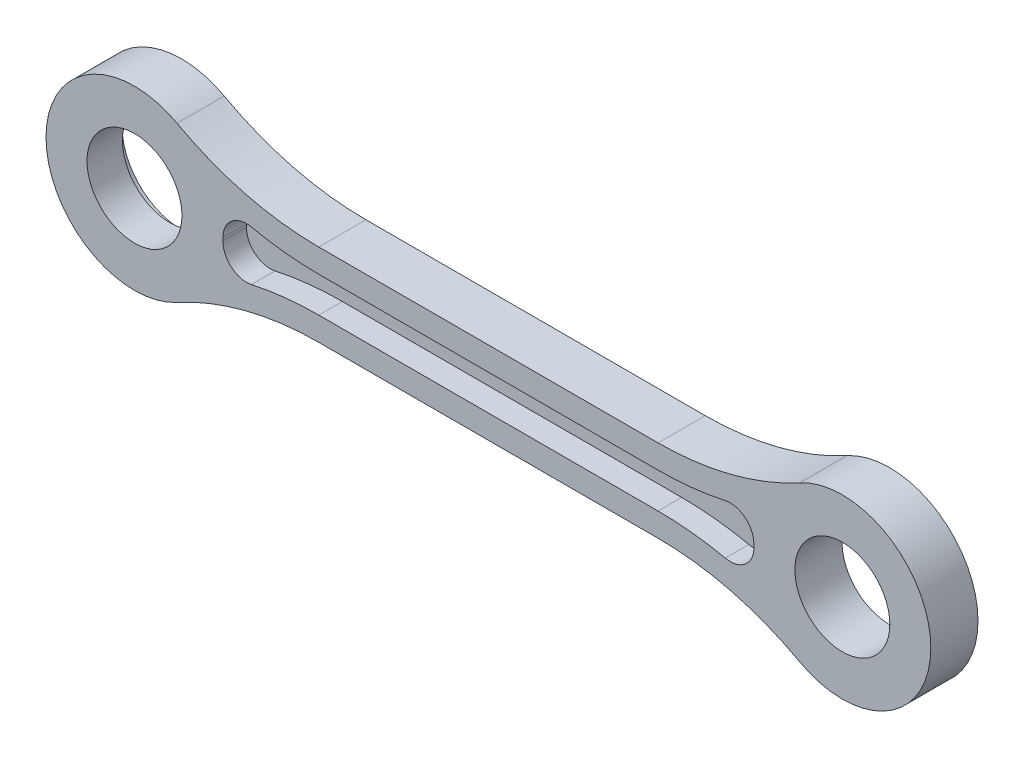
ISO-10303-21;
HEADER;
FILE_DESCRIPTION(('STEP AP214'),'2;1');
FILE_NAME('part.step','',(''),(''),'','','');
FILE_SCHEMA(('AUTOMOTIVE_DESIGN { 1 0 10303 214 1 1 1 1 }'));
ENDSEC;
DATA;
#1=APPLICATION_CONTEXT('core data for automotive mechanical design processes');
#2=APPLICATION_PROTOCOL_DEFINITION('international standard','automotive_design',2000,#1);
#3=PRODUCT_CONTEXT('',#1,'mechanical');
#4=PRODUCT('Part','Part','',(#3));
#5=PRODUCT_RELATED_PRODUCT_CATEGORY('part','',(#4));
#6=PRODUCT_DEFINITION_FORMATION('','',#4);
#7=PRODUCT_DEFINITION_CONTEXT('part definition',#1,'design');
#8=PRODUCT_DEFINITION('design','',#6,#7);
#9=PRODUCT_DEFINITION_SHAPE('','',#8);
#10=(LENGTH_UNIT() NAMED_UNIT(*) SI_UNIT(.MILLI.,.METRE.));
#11=(NAMED_UNIT(*) PLANE_ANGLE_UNIT() SI_UNIT($,.RADIAN.));
#12=(NAMED_UNIT(*) SI_UNIT($,.STERADIAN.) SOLID_ANGLE_UNIT());
#13=UNCERTAINTY_MEASURE_WITH_UNIT(LENGTH_MEASURE(1.E-05),#10,'distance_accuracy_value','');
#14=(GEOMETRIC_REPRESENTATION_CONTEXT(3) GLOBAL_UNCERTAINTY_ASSIGNED_CONTEXT((#13)) GLOBAL_UNIT_ASSIGNED_CONTEXT((#10,
#11,#12)) REPRESENTATION_CONTEXT('',''));
#15=CARTESIAN_POINT('',(0.,0.,0.));
#16=DIRECTION('',(0.,0.,1.));
#17=DIRECTION('',(1.,0.,0.));
#18=AXIS2_PLACEMENT_3D('',#15,#16,#17);
#19=CARTESIAN_POINT('',(-30.,0.,4.));
#20=DIRECTION('',(0.,0.,1.));
#21=DIRECTION('',(1.,0.,0.));
#22=AXIS2_PLACEMENT_3D('',#19,#20,#21);
#23=PLANE('',#22);
#24=CARTESIAN_POINT('',(-30.,0.,4.));
#25=DIRECTION('',(0.,0.,1.));
#26=DIRECTION('',(1.,0.,0.));
#27=AXIS2_PLACEMENT_3D('',#24,#25,#26);
#28=CIRCLE('',#27,4.025);
#29=CARTESIAN_POINT('',(-25.975,0.,4.));
#30=VERTEX_POINT('',#29);
#31=EDGE_CURVE('E291',#30,#30,#28,.T.);
#32=ORIENTED_EDGE('',*,*,#31,.F.);
#33=EDGE_LOOP('',(#32));
#34=FACE_BOUND('',#33,.T.);
#35=CARTESIAN_POINT('',(30.,0.,4.));
#36=DIRECTION('',(0.,0.,1.));
#37=DIRECTION('',(1.,0.,0.));
#38=AXIS2_PLACEMENT_3D('',#35,#36,#37);
#39=CIRCLE('',#38,4.025);
#40=CARTESIAN_POINT('',(34.025,0.,4.));
#41=VERTEX_POINT('',#40);
#42=EDGE_CURVE('E288',#41,#41,#39,.T.);
#43=ORIENTED_EDGE('',*,*,#42,.F.);
#44=EDGE_LOOP('',(#43));
#45=FACE_BOUND('',#44,.T.);
#46=CARTESIAN_POINT('',(-14.3795006481867,28.5,4.));
#47=DIRECTION('',(0.,0.,1.));
#48=DIRECTION('',(1.,0.,0.));
#49=AXIS2_PLACEMENT_3D('',#46,#47,#48);
#50=CIRCLE('',#49,25.);
#51=CARTESIAN_POINT('',(-14.3795006481867,3.5,4.));
#52=VERTEX_POINT('',#51);
#53=CARTESIAN_POINT('',(-26.3952693803508,6.57692307692308,4.));
#54=VERTEX_POINT('',#53);
#55=EDGE_CURVE('E249',#52,#54,#50,.F.);
#56=ORIENTED_EDGE('',*,*,#55,.T.);
#57=CARTESIAN_POINT('',(-30.,0.,4.));
#58=DIRECTION('',(0.,0.,1.));
#59=DIRECTION('',(1.,0.,0.));
#60=AXIS2_PLACEMENT_3D('',#57,#58,#59);
#61=CIRCLE('',#60,7.5);
#62=CARTESIAN_POINT('',(-26.3952693803508,-6.57692307692308,4.));
#63=VERTEX_POINT('',#62);
#64=EDGE_CURVE('E297',#54,#63,#61,.T.);
#65=ORIENTED_EDGE('',*,*,#64,.T.);
#66=CARTESIAN_POINT('',(-14.3795006481867,-28.5,4.));
#67=DIRECTION('',(0.,0.,1.));
#68=DIRECTION('',(1.,0.,0.));
#69=AXIS2_PLACEMENT_3D('',#66,#67,#68);
#70=CIRCLE('',#69,25.);
#71=CARTESIAN_POINT('',(-14.3795006481867,-3.5,4.));
#72=VERTEX_POINT('',#71);
#73=EDGE_CURVE('E276',#72,#63,#70,.T.);
#74=ORIENTED_EDGE('',*,*,#73,.F.);
#75=DIRECTION('',(1.,0.,0.));
#76=VECTOR('',#75,1.);
#77=CARTESIAN_POINT('',(0.,-3.5,4.));
#78=LINE('',#77,#76);
#79=CARTESIAN_POINT('',(14.3795006481867,-3.5,4.));
#80=VERTEX_POINT('',#79);
#81=EDGE_CURVE('E273',#72,#80,#78,.T.);
#82=ORIENTED_EDGE('',*,*,#81,.T.);
#83=CARTESIAN_POINT('',(14.3795006481867,-28.5,4.));
#84=DIRECTION('',(0.,0.,1.));
#85=DIRECTION('',(1.,0.,0.));
#86=AXIS2_PLACEMENT_3D('',#83,#84,#85);
#87=CIRCLE('',#86,25.);
#88=CARTESIAN_POINT('',(26.3952693803508,-6.57692307692309,4.));
#89=VERTEX_POINT('',#88);
#90=EDGE_CURVE('E270',#80,#89,#87,.F.);
#91=ORIENTED_EDGE('',*,*,#90,.T.);
#92=CARTESIAN_POINT('',(30.,0.,4.));
#93=DIRECTION('',(0.,0.,1.));
#94=DIRECTION('',(1.,0.,0.));
#95=AXIS2_PLACEMENT_3D('',#92,#93,#94);
#96=CIRCLE('',#95,7.5);
#97=CARTESIAN_POINT('',(26.3952693803508,6.57692307692309,4.));
#98=VERTEX_POINT('',#97);
#99=EDGE_CURVE('E299',#89,#98,#96,.T.);
#100=ORIENTED_EDGE('',*,*,#99,.T.);
#101=CARTESIAN_POINT('',(14.3795006481867,28.5,4.));
#102=DIRECTION('',(0.,0.,1.));
#103=DIRECTION('',(1.,0.,0.));
#104=AXIS2_PLACEMENT_3D('',#101,#102,#103);
#105=CIRCLE('',#104,25.);
#106=CARTESIAN_POINT('',(14.3795006481867,3.5,4.));
#107=VERTEX_POINT('',#106);
#108=EDGE_CURVE('E256',#107,#98,#105,.T.);
#109=ORIENTED_EDGE('',*,*,#108,.F.);
#110=DIRECTION('',(1.,0.,0.));
#111=VECTOR('',#110,1.);
#112=CARTESIAN_POINT('',(0.,3.5,4.));
#113=LINE('',#112,#111);
#114=EDGE_CURVE('E252',#52,#107,#113,.T.);
#115=ORIENTED_EDGE('',*,*,#114,.F.);
#116=EDGE_LOOP('',(#56,#65,#74,#82,#91,#100,#109,#115));
#117=FACE_BOUND('',#116,.T.);
#118=CARTESIAN_POINT('',(14.3795006481867,28.5,4.));
#119=DIRECTION('',(0.,0.,1.));
#120=DIRECTION('',(1.,0.,0.));
#121=AXIS2_PLACEMENT_3D('',#118,#119,#120);
#122=CIRCLE('',#121,27.);
#123=CARTESIAN_POINT('',(14.3795006481867,1.5,4.));
#124=VERTEX_POINT('',#123);
#125=CARTESIAN_POINT('',(20.079051200197,2.10842703617158,4.));
#126=VERTEX_POINT('',#125);
#127=EDGE_CURVE('E181',#124,#126,#122,.T.);
#128=ORIENTED_EDGE('',*,*,#127,.T.);
#129=CARTESIAN_POINT('',(20.5012401299755,0.153495705517621,4.));
#130=DIRECTION('',(0.,0.,1.));
#131=DIRECTION('',(1.,0.,0.));
#132=AXIS2_PLACEMENT_3D('',#129,#130,#131);
#133=CIRCLE('',#132,2.);
#134=CARTESIAN_POINT('',(22.5009790499806,0.12118082014549,4.));
#135=VERTEX_POINT('',#134);
#136=EDGE_CURVE('E11',#126,#135,#133,.F.);
#137=ORIENTED_EDGE('',*,*,#136,.T.);
#138=CARTESIAN_POINT('',(30.,0.,4.));
#139=DIRECTION('',(0.,0.,1.));
#140=DIRECTION('',(1.,0.,0.));
#141=AXIS2_PLACEMENT_3D('',#138,#139,#140);
#142=CIRCLE('',#141,7.50000000000001);
#143=CARTESIAN_POINT('',(22.5009790499806,-0.121180820145491,4.));
#144=VERTEX_POINT('',#143);
#145=EDGE_CURVE('E218',#135,#144,#142,.T.);
#146=ORIENTED_EDGE('',*,*,#145,.T.);
#147=CARTESIAN_POINT('',(20.5012401299755,-0.153495705517622,4.));
#148=DIRECTION('',(0.,0.,1.));
#149=DIRECTION('',(1.,0.,0.));
#150=AXIS2_PLACEMENT_3D('',#147,#148,#149);
#151=CIRCLE('',#150,2.);
#152=CARTESIAN_POINT('',(20.079051200197,-2.10842703617158,4.));
#153=VERTEX_POINT('',#152);
#154=EDGE_CURVE('E49',#144,#153,#151,.F.);
#155=ORIENTED_EDGE('',*,*,#154,.T.);
#156=CARTESIAN_POINT('',(14.3795006481867,-28.5,4.));
#157=DIRECTION('',(0.,0.,1.));
#158=DIRECTION('',(1.,0.,0.));
#159=AXIS2_PLACEMENT_3D('',#156,#157,#158);
#160=CIRCLE('',#159,27.);
#161=CARTESIAN_POINT('',(14.3795006481867,-1.5,4.));
#162=VERTEX_POINT('',#161);
#163=EDGE_CURVE('E234',#153,#162,#160,.T.);
#164=ORIENTED_EDGE('',*,*,#163,.T.);
#165=DIRECTION('',(1.,0.,0.));
#166=VECTOR('',#165,1.);
#167=CARTESIAN_POINT('',(0.,-1.5,4.));
#168=LINE('',#167,#166);
#169=CARTESIAN_POINT('',(-14.3795006481867,-1.5,4.));
#170=VERTEX_POINT('',#169);
#171=EDGE_CURVE('E231',#170,#162,#168,.T.);
#172=ORIENTED_EDGE('',*,*,#171,.F.);
#173=CARTESIAN_POINT('',(-14.3795006481867,-28.5,4.));
#174=DIRECTION('',(0.,0.,1.));
#175=DIRECTION('',(1.,0.,0.));
#176=AXIS2_PLACEMENT_3D('',#173,#174,#175);
#177=CIRCLE('',#176,27.);
#178=CARTESIAN_POINT('',(-20.079051200197,-2.10842703617158,4.));
#179=VERTEX_POINT('',#178);
#180=EDGE_CURVE('E228',#170,#179,#177,.T.);
#181=ORIENTED_EDGE('',*,*,#180,.T.);
#182=CARTESIAN_POINT('',(-20.5012401299755,-0.153495705517619,4.));
#183=DIRECTION('',(0.,0.,1.));
#184=DIRECTION('',(1.,0.,0.));
#185=AXIS2_PLACEMENT_3D('',#182,#183,#184);
#186=CIRCLE('',#185,2.);
#187=CARTESIAN_POINT('',(-22.5009790499807,-0.121180820145489,4.));
#188=VERTEX_POINT('',#187);
#189=EDGE_CURVE('E349',#179,#188,#186,.F.);
#190=ORIENTED_EDGE('',*,*,#189,.T.);
#191=CARTESIAN_POINT('',(-30.,0.,4.));
#192=DIRECTION('',(0.,0.,1.));
#193=DIRECTION('',(1.,0.,0.));
#194=AXIS2_PLACEMENT_3D('',#191,#192,#193);
#195=CIRCLE('',#194,7.5);
#196=CARTESIAN_POINT('',(-22.5009790499807,0.121180820145488,4.));
#197=VERTEX_POINT('',#196);
#198=EDGE_CURVE('E225',#188,#197,#195,.T.);
#199=ORIENTED_EDGE('',*,*,#198,.T.);
#200=CARTESIAN_POINT('',(-20.5012401299755,0.153495705517618,4.));
#201=DIRECTION('',(0.,0.,1.));
#202=DIRECTION('',(1.,0.,0.));
#203=AXIS2_PLACEMENT_3D('',#200,#201,#202);
#204=CIRCLE('',#203,2.);
#205=CARTESIAN_POINT('',(-20.079051200197,2.10842703617158,4.));
#206=VERTEX_POINT('',#205);
#207=EDGE_CURVE('E351',#197,#206,#204,.F.);
#208=ORIENTED_EDGE('',*,*,#207,.T.);
#209=CARTESIAN_POINT('',(-14.3795006481867,28.5,4.));
#210=DIRECTION('',(0.,0.,1.));
#211=DIRECTION('',(1.,0.,0.));
#212=AXIS2_PLACEMENT_3D('',#209,#210,#211);
#213=CIRCLE('',#212,27.);
#214=CARTESIAN_POINT('',(-14.3795006481867,1.5,4.));
#215=VERTEX_POINT('',#214);
#216=EDGE_CURVE('E223',#206,#215,#213,.T.);
#217=ORIENTED_EDGE('',*,*,#216,.T.);
#218=DIRECTION('',(-1.,0.,0.));
#219=VECTOR('',#218,1.);
#220=CARTESIAN_POINT('',(0.,1.5,4.));
#221=LINE('',#220,#219);
#222=EDGE_CURVE('E221',#124,#215,#221,.T.);
#223=ORIENTED_EDGE('',*,*,#222,.F.);
#224=EDGE_LOOP('',(#128,#137,#146,#155,#164,#172,#181,#190,#199,#208,#217,#223));
#225=FACE_BOUND('',#224,.T.);
#226=ADVANCED_FACE('F41',(#34,#45,#117,#225),#23,.T.);
#227=CARTESIAN_POINT('',(-30.,0.,4.));
#228=DIRECTION('',(0.,0.,-1.));
#229=DIRECTION('',(-1.,0.,0.));
#230=AXIS2_PLACEMENT_3D('',#227,#228,#229);
#231=CYLINDRICAL_SURFACE('',#230,4.025);
#232=ORIENTED_EDGE('',*,*,#31,.T.);
#233=EDGE_LOOP('',(#232));
#234=FACE_BOUND('',#233,.T.);
#235=CARTESIAN_POINT('',(-30.,0.,1.));
#236=DIRECTION('',(0.,0.,-1.));
#237=DIRECTION('',(-1.,0.,0.));
#238=AXIS2_PLACEMENT_3D('',#235,#236,#237);
#239=CIRCLE('',#238,4.025);
#240=CARTESIAN_POINT('',(-34.025,0.,1.));
#241=VERTEX_POINT('',#240);
#242=EDGE_CURVE('E246',#241,#241,#239,.T.);
#243=ORIENTED_EDGE('',*,*,#242,.T.);
#244=EDGE_LOOP('',(#243));
#245=FACE_BOUND('',#244,.T.);
#246=ADVANCED_FACE('F393',(#234,#245),#231,.F.);
#247=CARTESIAN_POINT('',(-30.,0.,0.));
#248=DIRECTION('',(0.,0.,1.));
#249=DIRECTION('',(1.,0.,0.));
#250=AXIS2_PLACEMENT_3D('',#247,#248,#249);
#251=PLANE('',#250);
#252=CARTESIAN_POINT('',(-30.,0.,0.));
#253=DIRECTION('',(0.,0.,-1.));
#254=DIRECTION('',(-1.,0.,0.));
#255=AXIS2_PLACEMENT_3D('',#252,#253,#254);
#256=CIRCLE('',#255,5.05);
#257=CARTESIAN_POINT('',(-35.05,0.,0.));
#258=VERTEX_POINT('',#257);
#259=EDGE_CURVE('E239',#258,#258,#256,.T.);
#260=ORIENTED_EDGE('',*,*,#259,.F.);
#261=EDGE_LOOP('',(#260));
#262=FACE_BOUND('',#261,.T.);
#263=CARTESIAN_POINT('',(30.,0.,0.));
#264=DIRECTION('',(0.,0.,1.));
#265=DIRECTION('',(1.,0.,0.));
#266=AXIS2_PLACEMENT_3D('',#263,#264,#265);
#267=CIRCLE('',#266,4.025);
#268=CARTESIAN_POINT('',(34.025,0.,0.));
#269=VERTEX_POINT('',#268);
#270=EDGE_CURVE('E263',#269,#269,#267,.T.);
#271=ORIENTED_EDGE('',*,*,#270,.T.);
#272=EDGE_LOOP('',(#271));
#273=FACE_BOUND('',#272,.T.);
#274=CARTESIAN_POINT('',(-30.,0.,0.));
#275=DIRECTION('',(0.,0.,1.));
#276=DIRECTION('',(1.,0.,0.));
#277=AXIS2_PLACEMENT_3D('',#274,#275,#276);
#278=CIRCLE('',#277,7.5);
#279=CARTESIAN_POINT('',(-26.3952693803508,6.57692307692308,0.));
#280=VERTEX_POINT('',#279);
#281=CARTESIAN_POINT('',(-26.3952693803508,-6.57692307692308,0.));
#282=VERTEX_POINT('',#281);
#283=EDGE_CURVE('E296',#280,#282,#278,.T.);
#284=ORIENTED_EDGE('',*,*,#283,.F.);
#285=CARTESIAN_POINT('',(-14.3795006481867,28.5,0.));
#286=DIRECTION('',(0.,0.,1.));
#287=DIRECTION('',(1.,0.,0.));
#288=AXIS2_PLACEMENT_3D('',#285,#286,#287);
#289=CIRCLE('',#288,25.);
#290=CARTESIAN_POINT('',(-14.3795006481867,3.5,0.));
#291=VERTEX_POINT('',#290);
#292=EDGE_CURVE('E318',#291,#280,#289,.F.);
#293=ORIENTED_EDGE('',*,*,#292,.F.);
#294=DIRECTION('',(1.,0.,0.));
#295=VECTOR('',#294,1.);
#296=CARTESIAN_POINT('',(-30.,3.5,0.));
#297=LINE('',#296,#295);
#298=CARTESIAN_POINT('',(14.3795006481867,3.5,0.));
#299=VERTEX_POINT('',#298);
#300=EDGE_CURVE('E312',#291,#299,#297,.T.);
#301=ORIENTED_EDGE('',*,*,#300,.T.);
#302=CARTESIAN_POINT('',(14.3795006481867,28.5,0.));
#303=DIRECTION('',(0.,0.,1.));
#304=DIRECTION('',(1.,0.,0.));
#305=AXIS2_PLACEMENT_3D('',#302,#303,#304);
#306=CIRCLE('',#305,25.);
#307=CARTESIAN_POINT('',(26.3952693803508,6.57692307692309,0.));
#308=VERTEX_POINT('',#307);
#309=EDGE_CURVE('E315',#299,#308,#306,.T.);
#310=ORIENTED_EDGE('',*,*,#309,.T.);
#311=CARTESIAN_POINT('',(30.,0.,0.));
#312=DIRECTION('',(0.,0.,1.));
#313=DIRECTION('',(1.,0.,0.));
#314=AXIS2_PLACEMENT_3D('',#311,#312,#313);
#315=CIRCLE('',#314,7.5);
#316=CARTESIAN_POINT('',(26.3952693803508,-6.57692307692309,0.));
#317=VERTEX_POINT('',#316);
#318=EDGE_CURVE('E300',#317,#308,#315,.T.);
#319=ORIENTED_EDGE('',*,*,#318,.F.);
#320=CARTESIAN_POINT('',(14.3795006481867,-28.5,0.));
#321=DIRECTION('',(0.,0.,1.));
#322=DIRECTION('',(1.,0.,0.));
#323=AXIS2_PLACEMENT_3D('',#320,#321,#322);
#324=CIRCLE('',#323,25.);
#325=CARTESIAN_POINT('',(14.3795006481867,-3.5,0.));
#326=VERTEX_POINT('',#325);
#327=EDGE_CURVE('E309',#326,#317,#324,.F.);
#328=ORIENTED_EDGE('',*,*,#327,.F.);
#329=DIRECTION('',(1.,0.,0.));
#330=VECTOR('',#329,1.);
#331=CARTESIAN_POINT('',(-30.,-3.5,0.));
#332=LINE('',#331,#330);
#333=CARTESIAN_POINT('',(-14.3795006481867,-3.5,0.));
#334=VERTEX_POINT('',#333);
#335=EDGE_CURVE('E302',#334,#326,#332,.T.);
#336=ORIENTED_EDGE('',*,*,#335,.F.);
#337=CARTESIAN_POINT('',(-14.3795006481867,-28.5,0.));
#338=DIRECTION('',(0.,0.,1.));
#339=DIRECTION('',(1.,0.,0.));
#340=AXIS2_PLACEMENT_3D('',#337,#338,#339);
#341=CIRCLE('',#340,25.);
#342=EDGE_CURVE('E306',#334,#282,#341,.T.);
#343=ORIENTED_EDGE('',*,*,#342,.T.);
#344=EDGE_LOOP('',(#284,#293,#301,#310,#319,#328,#336,#343));
#345=FACE_BOUND('',#344,.T.);
#346=ADVANCED_FACE('F401',(#262,#273,#345),#251,.F.);
#347=CARTESIAN_POINT('',(-30.,0.,4.));
#348=DIRECTION('',(0.,0.,-1.));
#349=DIRECTION('',(-1.,0.,0.));
#350=AXIS2_PLACEMENT_3D('',#347,#348,#349);
#351=CYLINDRICAL_SURFACE('',#350,7.5);
#352=ORIENTED_EDGE('',*,*,#283,.T.);
#353=DIRECTION('',(0.,0.,1.));
#354=VECTOR('',#353,1.);
#355=CARTESIAN_POINT('',(-26.3952693803508,-6.57692307692308,-6.));
#356=LINE('',#355,#354);
#357=EDGE_CURVE('E282',#282,#63,#356,.T.);
#358=ORIENTED_EDGE('',*,*,#357,.T.);
#359=ORIENTED_EDGE('',*,*,#64,.F.);
#360=DIRECTION('',(0.,0.,1.));
#361=VECTOR('',#360,1.);
#362=CARTESIAN_POINT('',(-26.3952693803508,6.57692307692308,-6.));
#363=LINE('',#362,#361);
#364=EDGE_CURVE('E260',#280,#54,#363,.T.);
#365=ORIENTED_EDGE('',*,*,#364,.F.);
#366=EDGE_LOOP('',(#352,#358,#359,#365));
#367=FACE_BOUND('',#366,.T.);
#368=ADVANCED_FACE('F410',(#367),#351,.T.);
#369=CARTESIAN_POINT('',(30.,0.,4.));
#370=DIRECTION('',(0.,0.,-1.));
#371=DIRECTION('',(-1.,0.,0.));
#372=AXIS2_PLACEMENT_3D('',#369,#370,#371);
#373=CYLINDRICAL_SURFACE('',#372,7.5);
#374=ORIENTED_EDGE('',*,*,#318,.T.);
#375=DIRECTION('',(0.,0.,1.));
#376=VECTOR('',#375,1.);
#377=CARTESIAN_POINT('',(26.3952693803508,6.57692307692309,-6.));
#378=LINE('',#377,#376);
#379=EDGE_CURVE('E264',#308,#98,#378,.T.);
#380=ORIENTED_EDGE('',*,*,#379,.T.);
#381=ORIENTED_EDGE('',*,*,#99,.F.);
#382=DIRECTION('',(0.,0.,1.));
#383=VECTOR('',#382,1.);
#384=CARTESIAN_POINT('',(26.3952693803508,-6.57692307692309,-6.));
#385=LINE('',#384,#383);
#386=EDGE_CURVE('E253',#317,#89,#385,.T.);
#387=ORIENTED_EDGE('',*,*,#386,.F.);
#388=EDGE_LOOP('',(#374,#380,#381,#387));
#389=FACE_BOUND('',#388,.T.);
#390=ADVANCED_FACE('F412',(#389),#373,.T.);
#391=CARTESIAN_POINT('',(30.,0.,4.));
#392=DIRECTION('',(0.,0.,-1.));
#393=DIRECTION('',(-1.,0.,0.));
#394=AXIS2_PLACEMENT_3D('',#391,#392,#393);
#395=CYLINDRICAL_SURFACE('',#394,4.025);
#396=ORIENTED_EDGE('',*,*,#42,.T.);
#397=EDGE_LOOP('',(#396));
#398=FACE_BOUND('',#397,.T.);
#399=ORIENTED_EDGE('',*,*,#270,.F.);
#400=EDGE_LOOP('',(#399));
#401=FACE_BOUND('',#400,.T.);
#402=ADVANCED_FACE('F415',(#398,#401),#395,.F.);
#403=CARTESIAN_POINT('',(-14.3795006481867,28.5,-6.));
#404=DIRECTION('',(0.,0.,1.));
#405=DIRECTION('',(1.,0.,0.));
#406=AXIS2_PLACEMENT_3D('',#403,#404,#405);
#407=CYLINDRICAL_SURFACE('',#406,25.);
#408=ORIENTED_EDGE('',*,*,#292,.T.);
#409=ORIENTED_EDGE('',*,*,#364,.T.);
#410=ORIENTED_EDGE('',*,*,#55,.F.);
#411=DIRECTION('',(0.,0.,1.));
#412=VECTOR('',#411,1.);
#413=CARTESIAN_POINT('',(-14.3795006481867,3.5,-6.));
#414=LINE('',#413,#412);
#415=EDGE_CURVE('E259',#291,#52,#414,.T.);
#416=ORIENTED_EDGE('',*,*,#415,.F.);
#417=EDGE_LOOP('',(#408,#409,#410,#416));
#418=FACE_BOUND('',#417,.T.);
#419=ADVANCED_FACE('F577',(#418),#407,.F.);
#420=CARTESIAN_POINT('',(14.3795006481867,28.5,-6.));
#421=DIRECTION('',(0.,0.,1.));
#422=DIRECTION('',(1.,0.,0.));
#423=AXIS2_PLACEMENT_3D('',#420,#421,#422);
#424=CYLINDRICAL_SURFACE('',#423,25.);
#425=DIRECTION('',(0.,0.,1.));
#426=VECTOR('',#425,1.);
#427=CARTESIAN_POINT('',(14.3795006481867,3.5,-6.));
#428=LINE('',#427,#426);
#429=EDGE_CURVE('E267',#299,#107,#428,.T.);
#430=ORIENTED_EDGE('',*,*,#429,.T.);
#431=ORIENTED_EDGE('',*,*,#108,.T.);
#432=ORIENTED_EDGE('',*,*,#379,.F.);
#433=ORIENTED_EDGE('',*,*,#309,.F.);
#434=EDGE_LOOP('',(#430,#431,#432,#433));
#435=FACE_BOUND('',#434,.T.);
#436=ADVANCED_FACE('F568',(#435),#424,.F.);
#437=CARTESIAN_POINT('',(0.,3.5,-6.));
#438=DIRECTION('',(0.,-1.,0.));
#439=DIRECTION('',(0.,0.,-1.));
#440=AXIS2_PLACEMENT_3D('',#437,#438,#439);
#441=PLANE('',#440);
#442=ORIENTED_EDGE('',*,*,#415,.T.);
#443=ORIENTED_EDGE('',*,*,#114,.T.);
#444=ORIENTED_EDGE('',*,*,#429,.F.);
#445=ORIENTED_EDGE('',*,*,#300,.F.);
#446=EDGE_LOOP('',(#442,#443,#444,#445));
#447=FACE_BOUND('',#446,.T.);
#448=ADVANCED_FACE('F559',(#447),#441,.F.);
#449=CARTESIAN_POINT('',(14.3795006481867,-28.5,-6.));
#450=DIRECTION('',(0.,0.,1.));
#451=DIRECTION('',(1.,0.,0.));
#452=AXIS2_PLACEMENT_3D('',#449,#450,#451);
#453=CYLINDRICAL_SURFACE('',#452,25.);
#454=ORIENTED_EDGE('',*,*,#327,.T.);
#455=ORIENTED_EDGE('',*,*,#386,.T.);
#456=ORIENTED_EDGE('',*,*,#90,.F.);
#457=DIRECTION('',(0.,0.,1.));
#458=VECTOR('',#457,1.);
#459=CARTESIAN_POINT('',(14.3795006481867,-3.5,-6.));
#460=LINE('',#459,#458);
#461=EDGE_CURVE('E279',#326,#80,#460,.T.);
#462=ORIENTED_EDGE('',*,*,#461,.F.);
#463=EDGE_LOOP('',(#454,#455,#456,#462));
#464=FACE_BOUND('',#463,.T.);
#465=ADVANCED_FACE('F550',(#464),#453,.F.);
#466=CARTESIAN_POINT('',(-14.3795006481867,-28.5,-6.));
#467=DIRECTION('',(0.,0.,1.));
#468=DIRECTION('',(1.,0.,0.));
#469=AXIS2_PLACEMENT_3D('',#466,#467,#468);
#470=CYLINDRICAL_SURFACE('',#469,25.);
#471=DIRECTION('',(0.,0.,1.));
#472=VECTOR('',#471,1.);
#473=CARTESIAN_POINT('',(-14.3795006481867,-3.5,-6.));
#474=LINE('',#473,#472);
#475=EDGE_CURVE('E285',#334,#72,#474,.T.);
#476=ORIENTED_EDGE('',*,*,#475,.T.);
#477=ORIENTED_EDGE('',*,*,#73,.T.);
#478=ORIENTED_EDGE('',*,*,#357,.F.);
#479=ORIENTED_EDGE('',*,*,#342,.F.);
#480=EDGE_LOOP('',(#476,#477,#478,#479));
#481=FACE_BOUND('',#480,.T.);
#482=ADVANCED_FACE('F541',(#481),#470,.F.);
#483=CARTESIAN_POINT('',(0.,-3.5,-6.));
#484=DIRECTION('',(0.,-1.,0.));
#485=DIRECTION('',(0.,0.,-1.));
#486=AXIS2_PLACEMENT_3D('',#483,#484,#485);
#487=PLANE('',#486);
#488=ORIENTED_EDGE('',*,*,#335,.T.);
#489=ORIENTED_EDGE('',*,*,#461,.T.);
#490=ORIENTED_EDGE('',*,*,#81,.F.);
#491=ORIENTED_EDGE('',*,*,#475,.F.);
#492=EDGE_LOOP('',(#488,#489,#490,#491));
#493=FACE_BOUND('',#492,.T.);
#494=ADVANCED_FACE('F526',(#493),#487,.T.);
#495=CARTESIAN_POINT('',(-30.,0.,1.));
#496=DIRECTION('',(0.,0.,-1.));
#497=DIRECTION('',(-1.,0.,0.));
#498=AXIS2_PLACEMENT_3D('',#495,#496,#497);
#499=CYLINDRICAL_SURFACE('',#498,5.05);
#500=CARTESIAN_POINT('',(-30.,0.,1.));
#501=DIRECTION('',(0.,0.,-1.));
#502=DIRECTION('',(-1.,0.,0.));
#503=AXIS2_PLACEMENT_3D('',#500,#501,#502);
#504=CIRCLE('',#503,5.05);
#505=CARTESIAN_POINT('',(-35.05,0.,1.));
#506=VERTEX_POINT('',#505);
#507=EDGE_CURVE('E243',#506,#506,#504,.T.);
#508=ORIENTED_EDGE('',*,*,#507,.F.);
#509=EDGE_LOOP('',(#508));
#510=FACE_BOUND('',#509,.T.);
#511=ORIENTED_EDGE('',*,*,#259,.T.);
#512=EDGE_LOOP('',(#511));
#513=FACE_BOUND('',#512,.T.);
#514=ADVANCED_FACE('F517',(#510,#513),#499,.F.);
#515=CARTESIAN_POINT('',(-30.,0.,1.));
#516=DIRECTION('',(0.,0.,-1.));
#517=DIRECTION('',(-1.,0.,0.));
#518=AXIS2_PLACEMENT_3D('',#515,#516,#517);
#519=PLANE('',#518);
#520=ORIENTED_EDGE('',*,*,#242,.F.);
#521=EDGE_LOOP('',(#520));
#522=FACE_BOUND('',#521,.T.);
#523=ORIENTED_EDGE('',*,*,#507,.T.);
#524=EDGE_LOOP('',(#523));
#525=FACE_BOUND('',#524,.T.);
#526=ADVANCED_FACE('F504',(#522,#525),#519,.T.);
#527=CARTESIAN_POINT('',(30.,0.,2.));
#528=DIRECTION('',(0.,0.,1.));
#529=DIRECTION('',(1.,0.,0.));
#530=AXIS2_PLACEMENT_3D('',#527,#528,#529);
#531=CYLINDRICAL_SURFACE('',#530,7.50000000000001);
#532=CARTESIAN_POINT('',(30.,0.,2.));
#533=DIRECTION('',(0.,0.,1.));
#534=DIRECTION('',(1.,0.,0.));
#535=AXIS2_PLACEMENT_3D('',#532,#533,#534);
#536=CIRCLE('',#535,7.50000000000001);
#537=CARTESIAN_POINT('',(22.5009790499806,0.12118082014549,2.));
#538=VERTEX_POINT('',#537);
#539=CARTESIAN_POINT('',(22.5009790499806,-0.121180820145491,2.));
#540=VERTEX_POINT('',#539);
#541=EDGE_CURVE('E198',#538,#540,#536,.T.);
#542=ORIENTED_EDGE('',*,*,#541,.T.);
#543=DIRECTION('',(0.,0.,1.));
#544=VECTOR('',#543,1.);
#545=CARTESIAN_POINT('',(22.5009790499806,-0.121180820145491,2.));
#546=LINE('',#545,#544);
#547=EDGE_CURVE('E342',#540,#144,#546,.T.);
#548=ORIENTED_EDGE('',*,*,#547,.T.);
#549=ORIENTED_EDGE('',*,*,#145,.F.);
#550=DIRECTION('',(0.,0.,1.));
#551=VECTOR('',#550,1.);
#552=CARTESIAN_POINT('',(22.5009790499806,0.12118082014549,2.));
#553=LINE('',#552,#551);
#554=EDGE_CURVE('E340',#135,#538,#553,.F.);
#555=ORIENTED_EDGE('',*,*,#554,.T.);
#556=EDGE_LOOP('',(#542,#548,#549,#555));
#557=FACE_BOUND('',#556,.T.);
#558=ADVANCED_FACE('F387',(#557),#531,.T.);
#559=CARTESIAN_POINT('',(14.3795006481867,-28.5,2.));
#560=DIRECTION('',(0.,0.,1.));
#561=DIRECTION('',(1.,0.,0.));
#562=AXIS2_PLACEMENT_3D('',#559,#560,#561);
#563=CYLINDRICAL_SURFACE('',#562,27.);
#564=ORIENTED_EDGE('',*,*,#163,.F.);
#565=DIRECTION('',(0.,0.,1.));
#566=VECTOR('',#565,1.);
#567=CARTESIAN_POINT('',(20.079051200197,-2.10842703617158,2.));
#568=LINE('',#567,#566);
#569=CARTESIAN_POINT('',(20.079051200197,-2.10842703617158,2.));
#570=VERTEX_POINT('',#569);
#571=EDGE_CURVE('E345',#153,#570,#568,.F.);
#572=ORIENTED_EDGE('',*,*,#571,.T.);
#573=CARTESIAN_POINT('',(14.3795006481867,-28.5,2.));
#574=DIRECTION('',(0.,0.,1.));
#575=DIRECTION('',(1.,0.,0.));
#576=AXIS2_PLACEMENT_3D('',#573,#574,#575);
#577=CIRCLE('',#576,27.);
#578=CARTESIAN_POINT('',(14.3795006481867,-1.5,2.));
#579=VERTEX_POINT('',#578);
#580=EDGE_CURVE('E187',#570,#579,#577,.T.);
#581=ORIENTED_EDGE('',*,*,#580,.T.);
#582=DIRECTION('',(0.,0.,1.));
#583=VECTOR('',#582,1.);
#584=CARTESIAN_POINT('',(14.3795006481867,-1.5,2.));
#585=LINE('',#584,#583);
#586=EDGE_CURVE('E236',#579,#162,#585,.T.);
#587=ORIENTED_EDGE('',*,*,#586,.T.);
#588=EDGE_LOOP('',(#564,#572,#581,#587));
#589=FACE_BOUND('',#588,.T.);
#590=ADVANCED_FACE('F491',(#589),#563,.T.);
#591=CARTESIAN_POINT('',(0.,-1.5,2.));
#592=DIRECTION('',(0.,-1.,0.));
#593=DIRECTION('',(1.,0.,0.));
#594=AXIS2_PLACEMENT_3D('',#591,#592,#593);
#595=PLANE('',#594);
#596=ORIENTED_EDGE('',*,*,#171,.T.);
#597=ORIENTED_EDGE('',*,*,#586,.F.);
#598=DIRECTION('',(1.,0.,0.));
#599=VECTOR('',#598,1.);
#600=CARTESIAN_POINT('',(0.,-1.5,2.));
#601=LINE('',#600,#599);
#602=CARTESIAN_POINT('',(-14.3795006481867,-1.5,2.));
#603=VERTEX_POINT('',#602);
#604=EDGE_CURVE('E214',#603,#579,#601,.T.);
#605=ORIENTED_EDGE('',*,*,#604,.F.);
#606=DIRECTION('',(0.,0.,1.));
#607=VECTOR('',#606,1.);
#608=CARTESIAN_POINT('',(-14.3795006481867,-1.5,2.));
#609=LINE('',#608,#607);
#610=EDGE_CURVE('E240',#603,#170,#609,.T.);
#611=ORIENTED_EDGE('',*,*,#610,.T.);
#612=EDGE_LOOP('',(#596,#597,#605,#611));
#613=FACE_BOUND('',#612,.T.);
#614=ADVANCED_FACE('F375',(#613),#595,.F.);
#615=CARTESIAN_POINT('',(-14.3795006481867,-28.5,2.));
#616=DIRECTION('',(0.,0.,1.));
#617=DIRECTION('',(1.,0.,0.));
#618=AXIS2_PLACEMENT_3D('',#615,#616,#617);
#619=CYLINDRICAL_SURFACE('',#618,27.);
#620=CARTESIAN_POINT('',(-14.3795006481867,-28.5,2.));
#621=DIRECTION('',(0.,0.,1.));
#622=DIRECTION('',(1.,0.,0.));
#623=AXIS2_PLACEMENT_3D('',#620,#621,#622);
#624=CIRCLE('',#623,27.);
#625=CARTESIAN_POINT('',(-20.079051200197,-2.10842703617158,2.));
#626=VERTEX_POINT('',#625);
#627=EDGE_CURVE('E211',#603,#626,#624,.T.);
#628=ORIENTED_EDGE('',*,*,#627,.T.);
#629=DIRECTION('',(0.,0.,1.));
#630=VECTOR('',#629,1.);
#631=CARTESIAN_POINT('',(-20.079051200197,-2.10842703617158,2.));
#632=LINE('',#631,#630);
#633=EDGE_CURVE('E321',#626,#179,#632,.T.);
#634=ORIENTED_EDGE('',*,*,#633,.T.);
#635=ORIENTED_EDGE('',*,*,#180,.F.);
#636=ORIENTED_EDGE('',*,*,#610,.F.);
#637=EDGE_LOOP('',(#628,#634,#635,#636));
#638=FACE_BOUND('',#637,.T.);
#639=ADVANCED_FACE('F371',(#638),#619,.T.);
#640=CARTESIAN_POINT('',(-30.,0.,2.));
#641=DIRECTION('',(0.,0.,1.));
#642=DIRECTION('',(1.,0.,0.));
#643=AXIS2_PLACEMENT_3D('',#640,#641,#642);
#644=CYLINDRICAL_SURFACE('',#643,7.5);
#645=ORIENTED_EDGE('',*,*,#198,.F.);
#646=DIRECTION('',(0.,0.,1.));
#647=VECTOR('',#646,1.);
#648=CARTESIAN_POINT('',(-22.5009790499807,-0.121180820145489,2.));
#649=LINE('',#648,#647);
#650=CARTESIAN_POINT('',(-22.5009790499807,-0.121180820145489,2.));
#651=VERTEX_POINT('',#650);
#652=EDGE_CURVE('E329',#188,#651,#649,.F.);
#653=ORIENTED_EDGE('',*,*,#652,.T.);
#654=CARTESIAN_POINT('',(-30.,0.,2.));
#655=DIRECTION('',(0.,0.,1.));
#656=DIRECTION('',(1.,0.,0.));
#657=AXIS2_PLACEMENT_3D('',#654,#655,#656);
#658=CIRCLE('',#657,7.5);
#659=CARTESIAN_POINT('',(-22.5009790499807,0.121180820145488,2.));
#660=VERTEX_POINT('',#659);
#661=EDGE_CURVE('E205',#651,#660,#658,.T.);
#662=ORIENTED_EDGE('',*,*,#661,.T.);
#663=DIRECTION('',(0.,0.,1.));
#664=VECTOR('',#663,1.);
#665=CARTESIAN_POINT('',(-22.5009790499807,0.121180820145488,2.));
#666=LINE('',#665,#664);
#667=EDGE_CURVE('E326',#660,#197,#666,.T.);
#668=ORIENTED_EDGE('',*,*,#667,.T.);
#669=EDGE_LOOP('',(#645,#653,#662,#668));
#670=FACE_BOUND('',#669,.T.);
#671=ADVANCED_FACE('F363',(#670),#644,.T.);
#672=CARTESIAN_POINT('',(-14.3795006481867,28.5,2.));
#673=DIRECTION('',(0.,0.,1.));
#674=DIRECTION('',(1.,0.,0.));
#675=AXIS2_PLACEMENT_3D('',#672,#673,#674);
#676=CYLINDRICAL_SURFACE('',#675,27.);
#677=ORIENTED_EDGE('',*,*,#216,.F.);
#678=DIRECTION('',(0.,0.,1.));
#679=VECTOR('',#678,1.);
#680=CARTESIAN_POINT('',(-20.079051200197,2.10842703617157,2.));
#681=LINE('',#680,#679);
#682=CARTESIAN_POINT('',(-20.079051200197,2.10842703617158,2.));
#683=VERTEX_POINT('',#682);
#684=EDGE_CURVE('E338',#206,#683,#681,.F.);
#685=ORIENTED_EDGE('',*,*,#684,.T.);
#686=CARTESIAN_POINT('',(-14.3795006481867,28.5,2.));
#687=DIRECTION('',(0.,0.,1.));
#688=DIRECTION('',(1.,0.,0.));
#689=AXIS2_PLACEMENT_3D('',#686,#687,#688);
#690=CIRCLE('',#689,27.);
#691=CARTESIAN_POINT('',(-14.3795006481867,1.5,2.));
#692=VERTEX_POINT('',#691);
#693=EDGE_CURVE('E203',#683,#692,#690,.T.);
#694=ORIENTED_EDGE('',*,*,#693,.T.);
#695=DIRECTION('',(0.,0.,1.));
#696=VECTOR('',#695,1.);
#697=CARTESIAN_POINT('',(-14.3795006481867,1.5,2.));
#698=LINE('',#697,#696);
#699=EDGE_CURVE('E186',#692,#215,#698,.T.);
#700=ORIENTED_EDGE('',*,*,#699,.T.);
#701=EDGE_LOOP('',(#677,#685,#694,#700));
#702=FACE_BOUND('',#701,.T.);
#703=ADVANCED_FACE('F358',(#702),#676,.T.);
#704=CARTESIAN_POINT('',(0.,1.5,2.));
#705=DIRECTION('',(0.,1.,0.));
#706=DIRECTION('',(-1.,0.,0.));
#707=AXIS2_PLACEMENT_3D('',#704,#705,#706);
#708=PLANE('',#707);
#709=ORIENTED_EDGE('',*,*,#222,.T.);
#710=ORIENTED_EDGE('',*,*,#699,.F.);
#711=DIRECTION('',(-1.,0.,0.));
#712=VECTOR('',#711,1.);
#713=CARTESIAN_POINT('',(0.,1.5,2.));
#714=LINE('',#713,#712);
#715=CARTESIAN_POINT('',(14.3795006481867,1.5,2.));
#716=VERTEX_POINT('',#715);
#717=EDGE_CURVE('E194',#716,#692,#714,.T.);
#718=ORIENTED_EDGE('',*,*,#717,.F.);
#719=DIRECTION('',(0.,0.,1.));
#720=VECTOR('',#719,1.);
#721=CARTESIAN_POINT('',(14.3795006481867,1.5,2.));
#722=LINE('',#721,#720);
#723=EDGE_CURVE('E176',#716,#124,#722,.T.);
#724=ORIENTED_EDGE('',*,*,#723,.T.);
#725=EDGE_LOOP('',(#709,#710,#718,#724));
#726=FACE_BOUND('',#725,.T.);
#727=ADVANCED_FACE('F201',(#726),#708,.F.);
#728=CARTESIAN_POINT('',(14.3795006481867,28.5,2.));
#729=DIRECTION('',(0.,0.,1.));
#730=DIRECTION('',(1.,0.,0.));
#731=AXIS2_PLACEMENT_3D('',#728,#729,#730);
#732=CYLINDRICAL_SURFACE('',#731,27.);
#733=CARTESIAN_POINT('',(14.3795006481867,28.5,2.));
#734=DIRECTION('',(0.,0.,1.));
#735=DIRECTION('',(1.,0.,0.));
#736=AXIS2_PLACEMENT_3D('',#733,#734,#735);
#737=CIRCLE('',#736,27.);
#738=CARTESIAN_POINT('',(20.079051200197,2.10842703617158,2.));
#739=VERTEX_POINT('',#738);
#740=EDGE_CURVE('E179',#716,#739,#737,.T.);
#741=ORIENTED_EDGE('',*,*,#740,.T.);
#742=DIRECTION('',(0.,0.,1.));
#743=VECTOR('',#742,1.);
#744=CARTESIAN_POINT('',(20.079051200197,2.10842703617158,2.));
#745=LINE('',#744,#743);
#746=EDGE_CURVE('E347',#739,#126,#745,.T.);
#747=ORIENTED_EDGE('',*,*,#746,.T.);
#748=ORIENTED_EDGE('',*,*,#127,.F.);
#749=ORIENTED_EDGE('',*,*,#723,.F.);
#750=EDGE_LOOP('',(#741,#747,#748,#749));
#751=FACE_BOUND('',#750,.T.);
#752=ADVANCED_FACE('F178',(#751),#732,.T.);
#753=CARTESIAN_POINT('',(0.,0.,2.));
#754=DIRECTION('',(0.,0.,1.));
#755=DIRECTION('',(1.,0.,0.));
#756=AXIS2_PLACEMENT_3D('',#753,#754,#755);
#757=PLANE('',#756);
#758=ORIENTED_EDGE('',*,*,#661,.F.);
#759=CARTESIAN_POINT('',(-20.5012401299755,-0.153495705517619,2.));
#760=DIRECTION('',(0.,0.,1.));
#761=DIRECTION('',(1.,0.,0.));
#762=AXIS2_PLACEMENT_3D('',#759,#760,#761);
#763=CIRCLE('',#762,2.);
#764=EDGE_CURVE('E336',#651,#626,#763,.T.);
#765=ORIENTED_EDGE('',*,*,#764,.T.);
#766=ORIENTED_EDGE('',*,*,#627,.F.);
#767=ORIENTED_EDGE('',*,*,#604,.T.);
#768=ORIENTED_EDGE('',*,*,#580,.F.);
#769=CARTESIAN_POINT('',(20.5012401299755,-0.153495705517622,2.));
#770=DIRECTION('',(0.,0.,1.));
#771=DIRECTION('',(1.,0.,0.));
#772=AXIS2_PLACEMENT_3D('',#769,#770,#771);
#773=CIRCLE('',#772,2.);
#774=EDGE_CURVE('E332',#570,#540,#773,.T.);
#775=ORIENTED_EDGE('',*,*,#774,.T.);
#776=ORIENTED_EDGE('',*,*,#541,.F.);
#777=CARTESIAN_POINT('',(20.5012401299755,0.153495705517621,2.));
#778=DIRECTION('',(0.,0.,1.));
#779=DIRECTION('',(1.,0.,0.));
#780=AXIS2_PLACEMENT_3D('',#777,#778,#779);
#781=CIRCLE('',#780,2.);
#782=EDGE_CURVE('E197',#538,#739,#781,.T.);
#783=ORIENTED_EDGE('',*,*,#782,.T.);
#784=ORIENTED_EDGE('',*,*,#740,.F.);
#785=ORIENTED_EDGE('',*,*,#717,.T.);
#786=ORIENTED_EDGE('',*,*,#693,.F.);
#787=CARTESIAN_POINT('',(-20.5012401299755,0.153495705517618,2.));
#788=DIRECTION('',(0.,0.,1.));
#789=DIRECTION('',(1.,0.,0.));
#790=AXIS2_PLACEMENT_3D('',#787,#788,#789);
#791=CIRCLE('',#790,2.);
#792=EDGE_CURVE('E334',#683,#660,#791,.T.);
#793=ORIENTED_EDGE('',*,*,#792,.T.);
#794=EDGE_LOOP('',(#758,#765,#766,#767,#768,#775,#776,#783,#784,#785,#786,#793));
#795=FACE_BOUND('',#794,.T.);
#796=ADVANCED_FACE('F192',(#795),#757,.T.);
#797=CARTESIAN_POINT('',(-20.5012401299755,-0.153495705517619,2.));
#798=DIRECTION('',(0.,0.,-1.));
#799=DIRECTION('',(-1.,0.,0.));
#800=AXIS2_PLACEMENT_3D('',#797,#798,#799);
#801=CYLINDRICAL_SURFACE('',#800,2.);
#802=ORIENTED_EDGE('',*,*,#764,.F.);
#803=ORIENTED_EDGE('',*,*,#652,.F.);
#804=ORIENTED_EDGE('',*,*,#189,.F.);
#805=ORIENTED_EDGE('',*,*,#633,.F.);
#806=EDGE_LOOP('',(#802,#803,#804,#805));
#807=FACE_BOUND('',#806,.T.);
#808=ADVANCED_FACE('F366',(#807),#801,.F.);
#809=CARTESIAN_POINT('',(-20.5012401299755,0.153495705517618,2.));
#810=DIRECTION('',(0.,0.,-1.));
#811=DIRECTION('',(-1.,0.,0.));
#812=AXIS2_PLACEMENT_3D('',#809,#810,#811);
#813=CYLINDRICAL_SURFACE('',#812,2.);
#814=ORIENTED_EDGE('',*,*,#792,.F.);
#815=ORIENTED_EDGE('',*,*,#684,.F.);
#816=ORIENTED_EDGE('',*,*,#207,.F.);
#817=ORIENTED_EDGE('',*,*,#667,.F.);
#818=EDGE_LOOP('',(#814,#815,#816,#817));
#819=FACE_BOUND('',#818,.T.);
#820=ADVANCED_FACE('F360',(#819),#813,.F.);
#821=CARTESIAN_POINT('',(20.5012401299755,-0.153495705517622,2.));
#822=DIRECTION('',(0.,0.,-1.));
#823=DIRECTION('',(-1.,0.,0.));
#824=AXIS2_PLACEMENT_3D('',#821,#822,#823);
#825=CYLINDRICAL_SURFACE('',#824,2.);
#826=ORIENTED_EDGE('',*,*,#774,.F.);
#827=ORIENTED_EDGE('',*,*,#571,.F.);
#828=ORIENTED_EDGE('',*,*,#154,.F.);
#829=ORIENTED_EDGE('',*,*,#547,.F.);
#830=EDGE_LOOP('',(#826,#827,#828,#829));
#831=FACE_BOUND('',#830,.T.);
#832=ADVANCED_FACE('F384',(#831),#825,.F.);
#833=CARTESIAN_POINT('',(20.5012401299755,0.153495705517621,2.));
#834=DIRECTION('',(0.,0.,-1.));
#835=DIRECTION('',(-1.,0.,0.));
#836=AXIS2_PLACEMENT_3D('',#833,#834,#835);
#837=CYLINDRICAL_SURFACE('',#836,2.);
#838=ORIENTED_EDGE('',*,*,#782,.F.);
#839=ORIENTED_EDGE('',*,*,#554,.F.);
#840=ORIENTED_EDGE('',*,*,#136,.F.);
#841=ORIENTED_EDGE('',*,*,#746,.F.);
#842=EDGE_LOOP('',(#838,#839,#840,#841));
#843=FACE_BOUND('',#842,.T.);
#844=ADVANCED_FACE('F43',(#843),#837,.F.);
#845=CLOSED_SHELL('',(#226,#246,#346,#368,#390,#402,#419,#436,#448,#465,#482,#494,#514,#526,
#558,#590,#614,#639,#671,#703,#727,#752,#796,#808,#820,#832,#844));
#846=MANIFOLD_SOLID_BREP('B2',#845);
#847=ADVANCED_BREP_SHAPE_REPRESENTATION('',(#18,#846),#14);
#848=SHAPE_DEFINITION_REPRESENTATION(#9,#847);
ENDSEC;
END-ISO-10303-21;
